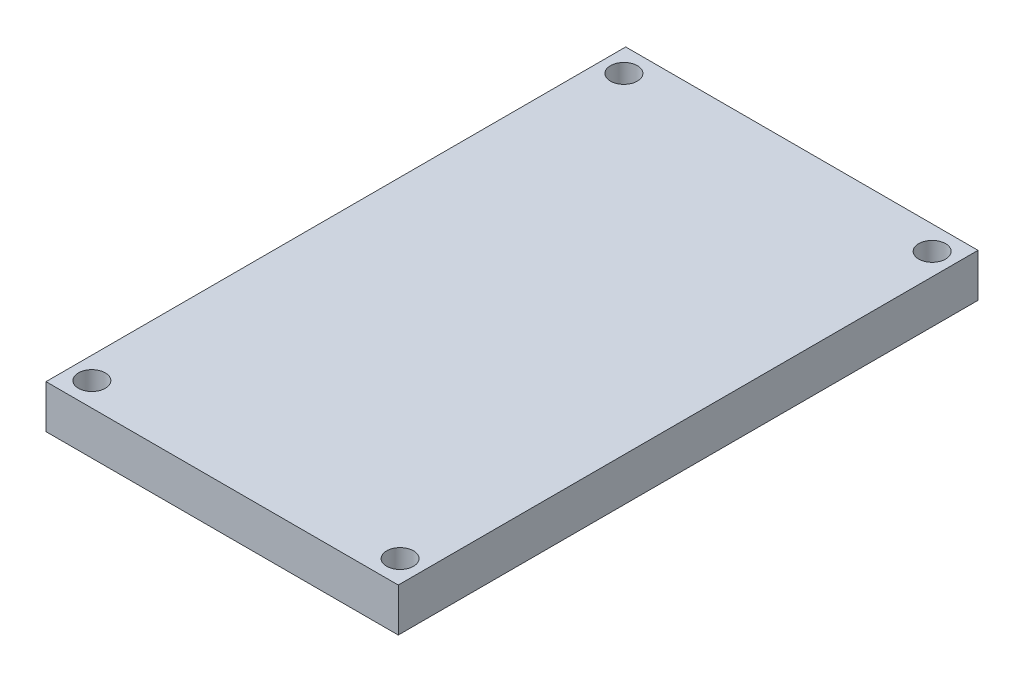
ISO-10303-21;
HEADER;
FILE_DESCRIPTION(('STEP AP214'),'2;1');
FILE_NAME('part.step','',(''),(''),'','','');
FILE_SCHEMA(('AUTOMOTIVE_DESIGN { 1 0 10303 214 1 1 1 1 }'));
ENDSEC;
DATA;
#1=APPLICATION_CONTEXT('core data for automotive mechanical design processes');
#2=APPLICATION_PROTOCOL_DEFINITION('international standard','automotive_design',2000,#1);
#3=PRODUCT_CONTEXT('',#1,'mechanical');
#4=PRODUCT('Part','Part','',(#3));
#5=PRODUCT_RELATED_PRODUCT_CATEGORY('part','',(#4));
#6=PRODUCT_DEFINITION_FORMATION('','',#4);
#7=PRODUCT_DEFINITION_CONTEXT('part definition',#1,'design');
#8=PRODUCT_DEFINITION('design','',#6,#7);
#9=PRODUCT_DEFINITION_SHAPE('','',#8);
#10=(LENGTH_UNIT() NAMED_UNIT(*) SI_UNIT(.MILLI.,.METRE.));
#11=(NAMED_UNIT(*) PLANE_ANGLE_UNIT() SI_UNIT($,.RADIAN.));
#12=(NAMED_UNIT(*) SI_UNIT($,.STERADIAN.) SOLID_ANGLE_UNIT());
#13=UNCERTAINTY_MEASURE_WITH_UNIT(LENGTH_MEASURE(1.E-05),#10,'distance_accuracy_value','');
#14=(GEOMETRIC_REPRESENTATION_CONTEXT(3) GLOBAL_UNCERTAINTY_ASSIGNED_CONTEXT((#13)) GLOBAL_UNIT_ASSIGNED_CONTEXT((#10,
#11,#12)) REPRESENTATION_CONTEXT('',''));
#15=CARTESIAN_POINT('',(0.,0.,0.));
#16=DIRECTION('',(0.,0.,1.));
#17=DIRECTION('',(1.,0.,0.));
#18=AXIS2_PLACEMENT_3D('',#15,#16,#17);
#19=CARTESIAN_POINT('',(0.,5.,0.));
#20=DIRECTION('',(0.,1.,0.));
#21=DIRECTION('',(0.,0.,1.));
#22=AXIS2_PLACEMENT_3D('',#19,#20,#21);
#23=PLANE('',#22);
#24=CARTESIAN_POINT('',(17.78,5.,30.69));
#25=DIRECTION('',(0.,1.,0.));
#26=DIRECTION('',(0.,0.,1.));
#27=AXIS2_PLACEMENT_3D('',#24,#25,#26);
#28=CIRCLE('',#27,1.55);
#29=CARTESIAN_POINT('',(17.78,5.,32.24));
#30=VERTEX_POINT('',#29);
#31=EDGE_CURVE('E129',#30,#30,#28,.T.);
#32=ORIENTED_EDGE('',*,*,#31,.F.);
#33=EDGE_LOOP('',(#32));
#34=FACE_BOUND('',#33,.T.);
#35=CARTESIAN_POINT('',(-17.78,5.,-30.69));
#36=DIRECTION('',(0.,1.,0.));
#37=DIRECTION('',(0.,0.,1.));
#38=AXIS2_PLACEMENT_3D('',#35,#36,#37);
#39=CIRCLE('',#38,1.55);
#40=CARTESIAN_POINT('',(-17.78,5.,-29.14));
#41=VERTEX_POINT('',#40);
#42=EDGE_CURVE('E108',#41,#41,#39,.T.);
#43=ORIENTED_EDGE('',*,*,#42,.F.);
#44=EDGE_LOOP('',(#43));
#45=FACE_BOUND('',#44,.T.);
#46=DIRECTION('',(0.,0.,-1.));
#47=VECTOR('',#46,1.);
#48=CARTESIAN_POINT('',(20.32,5.,-33.44));
#49=LINE('',#48,#47);
#50=CARTESIAN_POINT('',(20.32,5.,33.44));
#51=VERTEX_POINT('',#50);
#52=CARTESIAN_POINT('',(20.32,5.,-33.44));
#53=VERTEX_POINT('',#52);
#54=EDGE_CURVE('E93',#51,#53,#49,.T.);
#55=ORIENTED_EDGE('',*,*,#54,.T.);
#56=DIRECTION('',(-1.,0.,0.));
#57=VECTOR('',#56,1.);
#58=CARTESIAN_POINT('',(-20.32,5.,-33.44));
#59=LINE('',#58,#57);
#60=CARTESIAN_POINT('',(-20.32,5.,-33.44));
#61=VERTEX_POINT('',#60);
#62=EDGE_CURVE('E88',#53,#61,#59,.T.);
#63=ORIENTED_EDGE('',*,*,#62,.T.);
#64=DIRECTION('',(0.,0.,1.));
#65=VECTOR('',#64,1.);
#66=CARTESIAN_POINT('',(-20.32,5.,-33.44));
#67=LINE('',#66,#65);
#68=CARTESIAN_POINT('',(-20.32,5.,33.44));
#69=VERTEX_POINT('',#68);
#70=EDGE_CURVE('E91',#61,#69,#67,.T.);
#71=ORIENTED_EDGE('',*,*,#70,.T.);
#72=DIRECTION('',(1.,0.,0.));
#73=VECTOR('',#72,1.);
#74=CARTESIAN_POINT('',(-20.32,5.,33.44));
#75=LINE('',#74,#73);
#76=EDGE_CURVE('E58',#69,#51,#75,.T.);
#77=ORIENTED_EDGE('',*,*,#76,.T.);
#78=EDGE_LOOP('',(#55,#63,#71,#77));
#79=FACE_BOUND('',#78,.T.);
#80=CARTESIAN_POINT('',(17.78,5.,-30.69));
#81=DIRECTION('',(0.,1.,0.));
#82=DIRECTION('',(0.,0.,-1.));
#83=AXIS2_PLACEMENT_3D('',#80,#81,#82);
#84=CIRCLE('',#83,1.55);
#85=CARTESIAN_POINT('',(17.78,5.,-32.24));
#86=VERTEX_POINT('',#85);
#87=EDGE_CURVE('E123',#86,#86,#84,.T.);
#88=ORIENTED_EDGE('',*,*,#87,.F.);
#89=EDGE_LOOP('',(#88));
#90=FACE_BOUND('',#89,.T.);
#91=CARTESIAN_POINT('',(-17.78,5.,30.69));
#92=DIRECTION('',(0.,1.,0.));
#93=DIRECTION('',(0.,0.,-1.));
#94=AXIS2_PLACEMENT_3D('',#91,#92,#93);
#95=CIRCLE('',#94,1.55);
#96=CARTESIAN_POINT('',(-17.78,5.,29.14));
#97=VERTEX_POINT('',#96);
#98=EDGE_CURVE('E135',#97,#97,#95,.T.);
#99=ORIENTED_EDGE('',*,*,#98,.F.);
#100=EDGE_LOOP('',(#99));
#101=FACE_BOUND('',#100,.T.);
#102=ADVANCED_FACE('F41',(#34,#45,#79,#90,#101),#23,.T.);
#103=CARTESIAN_POINT('',(0.,0.,0.));
#104=DIRECTION('',(0.,1.,0.));
#105=DIRECTION('',(0.,0.,1.));
#106=AXIS2_PLACEMENT_3D('',#103,#104,#105);
#107=PLANE('',#106);
#108=DIRECTION('',(0.,0.,-1.));
#109=VECTOR('',#108,1.);
#110=CARTESIAN_POINT('',(20.32,0.,-33.44));
#111=LINE('',#110,#109);
#112=CARTESIAN_POINT('',(20.32,0.,33.44));
#113=VERTEX_POINT('',#112);
#114=CARTESIAN_POINT('',(20.32,0.,-33.44));
#115=VERTEX_POINT('',#114);
#116=EDGE_CURVE('E105',#113,#115,#111,.T.);
#117=ORIENTED_EDGE('',*,*,#116,.F.);
#118=DIRECTION('',(1.,0.,0.));
#119=VECTOR('',#118,1.);
#120=CARTESIAN_POINT('',(-20.32,0.,33.44));
#121=LINE('',#120,#119);
#122=CARTESIAN_POINT('',(-20.32,0.,33.44));
#123=VERTEX_POINT('',#122);
#124=EDGE_CURVE('E81',#123,#113,#121,.T.);
#125=ORIENTED_EDGE('',*,*,#124,.F.);
#126=DIRECTION('',(0.,0.,1.));
#127=VECTOR('',#126,1.);
#128=CARTESIAN_POINT('',(-20.32,0.,-33.44));
#129=LINE('',#128,#127);
#130=CARTESIAN_POINT('',(-20.32,0.,-33.44));
#131=VERTEX_POINT('',#130);
#132=EDGE_CURVE('E75',#131,#123,#129,.T.);
#133=ORIENTED_EDGE('',*,*,#132,.F.);
#134=DIRECTION('',(-1.,0.,0.));
#135=VECTOR('',#134,1.);
#136=CARTESIAN_POINT('',(-20.32,0.,-33.44));
#137=LINE('',#136,#135);
#138=EDGE_CURVE('E97',#115,#131,#137,.T.);
#139=ORIENTED_EDGE('',*,*,#138,.F.);
#140=EDGE_LOOP('',(#117,#125,#133,#139));
#141=FACE_BOUND('',#140,.T.);
#142=CARTESIAN_POINT('',(-17.78,0.,-30.69));
#143=DIRECTION('',(0.,1.,0.));
#144=DIRECTION('',(0.,0.,1.));
#145=AXIS2_PLACEMENT_3D('',#142,#143,#144);
#146=CIRCLE('',#145,1.55);
#147=CARTESIAN_POINT('',(-17.78,0.,-29.14));
#148=VERTEX_POINT('',#147);
#149=EDGE_CURVE('E120',#148,#148,#146,.T.);
#150=ORIENTED_EDGE('',*,*,#149,.T.);
#151=EDGE_LOOP('',(#150));
#152=FACE_BOUND('',#151,.T.);
#153=CARTESIAN_POINT('',(17.78,0.,-30.69));
#154=DIRECTION('',(0.,1.,0.));
#155=DIRECTION('',(0.,0.,-1.));
#156=AXIS2_PLACEMENT_3D('',#153,#154,#155);
#157=CIRCLE('',#156,1.55);
#158=CARTESIAN_POINT('',(17.78,0.,-32.24));
#159=VERTEX_POINT('',#158);
#160=EDGE_CURVE('E126',#159,#159,#157,.T.);
#161=ORIENTED_EDGE('',*,*,#160,.T.);
#162=EDGE_LOOP('',(#161));
#163=FACE_BOUND('',#162,.T.);
#164=CARTESIAN_POINT('',(17.78,0.,30.69));
#165=DIRECTION('',(0.,1.,0.));
#166=DIRECTION('',(0.,0.,1.));
#167=AXIS2_PLACEMENT_3D('',#164,#165,#166);
#168=CIRCLE('',#167,1.55);
#169=CARTESIAN_POINT('',(17.78,0.,32.24));
#170=VERTEX_POINT('',#169);
#171=EDGE_CURVE('E132',#170,#170,#168,.T.);
#172=ORIENTED_EDGE('',*,*,#171,.T.);
#173=EDGE_LOOP('',(#172));
#174=FACE_BOUND('',#173,.T.);
#175=CARTESIAN_POINT('',(-17.78,0.,30.69));
#176=DIRECTION('',(0.,1.,0.));
#177=DIRECTION('',(0.,0.,-1.));
#178=AXIS2_PLACEMENT_3D('',#175,#176,#177);
#179=CIRCLE('',#178,1.55);
#180=CARTESIAN_POINT('',(-17.78,0.,29.14));
#181=VERTEX_POINT('',#180);
#182=EDGE_CURVE('E138',#181,#181,#179,.T.);
#183=ORIENTED_EDGE('',*,*,#182,.T.);
#184=EDGE_LOOP('',(#183));
#185=FACE_BOUND('',#184,.T.);
#186=ADVANCED_FACE('F116',(#141,#152,#163,#174,#185),#107,.F.);
#187=CARTESIAN_POINT('',(20.32,5.,-33.44));
#188=DIRECTION('',(-1.,0.,0.));
#189=DIRECTION('',(0.,0.,1.));
#190=AXIS2_PLACEMENT_3D('',#187,#188,#189);
#191=PLANE('',#190);
#192=ORIENTED_EDGE('',*,*,#116,.T.);
#193=DIRECTION('',(0.,-1.,0.));
#194=VECTOR('',#193,1.);
#195=CARTESIAN_POINT('',(20.32,5.,-33.44));
#196=LINE('',#195,#194);
#197=EDGE_CURVE('E11',#53,#115,#196,.T.);
#198=ORIENTED_EDGE('',*,*,#197,.F.);
#199=ORIENTED_EDGE('',*,*,#54,.F.);
#200=DIRECTION('',(0.,-1.,0.));
#201=VECTOR('',#200,1.);
#202=CARTESIAN_POINT('',(20.32,5.,33.44));
#203=LINE('',#202,#201);
#204=EDGE_CURVE('E101',#51,#113,#203,.T.);
#205=ORIENTED_EDGE('',*,*,#204,.T.);
#206=EDGE_LOOP('',(#192,#198,#199,#205));
#207=FACE_BOUND('',#206,.T.);
#208=ADVANCED_FACE('F43',(#207),#191,.F.);
#209=CARTESIAN_POINT('',(-20.32,5.,-33.44));
#210=DIRECTION('',(0.,0.,1.));
#211=DIRECTION('',(1.,0.,0.));
#212=AXIS2_PLACEMENT_3D('',#209,#210,#211);
#213=PLANE('',#212);
#214=ORIENTED_EDGE('',*,*,#138,.T.);
#215=DIRECTION('',(0.,-1.,0.));
#216=VECTOR('',#215,1.);
#217=CARTESIAN_POINT('',(-20.32,5.,-33.44));
#218=LINE('',#217,#216);
#219=EDGE_CURVE('E50',#61,#131,#218,.T.);
#220=ORIENTED_EDGE('',*,*,#219,.F.);
#221=ORIENTED_EDGE('',*,*,#62,.F.);
#222=ORIENTED_EDGE('',*,*,#197,.T.);
#223=EDGE_LOOP('',(#214,#220,#221,#222));
#224=FACE_BOUND('',#223,.T.);
#225=ADVANCED_FACE('F96',(#224),#213,.F.);
#226=CARTESIAN_POINT('',(-20.32,5.,-33.44));
#227=DIRECTION('',(1.,0.,0.));
#228=DIRECTION('',(0.,0.,-1.));
#229=AXIS2_PLACEMENT_3D('',#226,#227,#228);
#230=PLANE('',#229);
#231=ORIENTED_EDGE('',*,*,#132,.T.);
#232=DIRECTION('',(0.,-1.,0.));
#233=VECTOR('',#232,1.);
#234=CARTESIAN_POINT('',(-20.32,5.,33.44));
#235=LINE('',#234,#233);
#236=EDGE_CURVE('E98',#69,#123,#235,.T.);
#237=ORIENTED_EDGE('',*,*,#236,.F.);
#238=ORIENTED_EDGE('',*,*,#70,.F.);
#239=ORIENTED_EDGE('',*,*,#219,.T.);
#240=EDGE_LOOP('',(#231,#237,#238,#239));
#241=FACE_BOUND('',#240,.T.);
#242=ADVANCED_FACE('F99',(#241),#230,.F.);
#243=CARTESIAN_POINT('',(-20.32,5.,33.44));
#244=DIRECTION('',(0.,0.,-1.));
#245=DIRECTION('',(-1.,0.,0.));
#246=AXIS2_PLACEMENT_3D('',#243,#244,#245);
#247=PLANE('',#246);
#248=ORIENTED_EDGE('',*,*,#124,.T.);
#249=ORIENTED_EDGE('',*,*,#204,.F.);
#250=ORIENTED_EDGE('',*,*,#76,.F.);
#251=ORIENTED_EDGE('',*,*,#236,.T.);
#252=EDGE_LOOP('',(#248,#249,#250,#251));
#253=FACE_BOUND('',#252,.T.);
#254=ADVANCED_FACE('F113',(#253),#247,.F.);
#255=CARTESIAN_POINT('',(-17.78,5.,-30.69));
#256=DIRECTION('',(0.,-1.,0.));
#257=DIRECTION('',(0.,0.,-1.));
#258=AXIS2_PLACEMENT_3D('',#255,#256,#257);
#259=CYLINDRICAL_SURFACE('',#258,1.55);
#260=ORIENTED_EDGE('',*,*,#42,.T.);
#261=EDGE_LOOP('',(#260));
#262=FACE_BOUND('',#261,.T.);
#263=ORIENTED_EDGE('',*,*,#149,.F.);
#264=EDGE_LOOP('',(#263));
#265=FACE_BOUND('',#264,.T.);
#266=ADVANCED_FACE('F157',(#262,#265),#259,.F.);
#267=CARTESIAN_POINT('',(17.78,5.,-30.69));
#268=DIRECTION('',(0.,-1.,0.));
#269=DIRECTION('',(0.,0.,-1.));
#270=AXIS2_PLACEMENT_3D('',#267,#268,#269);
#271=CYLINDRICAL_SURFACE('',#270,1.55);
#272=ORIENTED_EDGE('',*,*,#87,.T.);
#273=EDGE_LOOP('',(#272));
#274=FACE_BOUND('',#273,.T.);
#275=ORIENTED_EDGE('',*,*,#160,.F.);
#276=EDGE_LOOP('',(#275));
#277=FACE_BOUND('',#276,.T.);
#278=ADVANCED_FACE('F202',(#274,#277),#271,.F.);
#279=CARTESIAN_POINT('',(17.78,5.,30.69));
#280=DIRECTION('',(0.,-1.,0.));
#281=DIRECTION('',(0.,0.,-1.));
#282=AXIS2_PLACEMENT_3D('',#279,#280,#281);
#283=CYLINDRICAL_SURFACE('',#282,1.55);
#284=ORIENTED_EDGE('',*,*,#31,.T.);
#285=EDGE_LOOP('',(#284));
#286=FACE_BOUND('',#285,.T.);
#287=ORIENTED_EDGE('',*,*,#171,.F.);
#288=EDGE_LOOP('',(#287));
#289=FACE_BOUND('',#288,.T.);
#290=ADVANCED_FACE('F210',(#286,#289),#283,.F.);
#291=CARTESIAN_POINT('',(-17.78,5.,30.69));
#292=DIRECTION('',(0.,-1.,0.));
#293=DIRECTION('',(0.,0.,-1.));
#294=AXIS2_PLACEMENT_3D('',#291,#292,#293);
#295=CYLINDRICAL_SURFACE('',#294,1.55);
#296=ORIENTED_EDGE('',*,*,#98,.T.);
#297=EDGE_LOOP('',(#296));
#298=FACE_BOUND('',#297,.T.);
#299=ORIENTED_EDGE('',*,*,#182,.F.);
#300=EDGE_LOOP('',(#299));
#301=FACE_BOUND('',#300,.T.);
#302=ADVANCED_FACE('F144',(#298,#301),#295,.F.);
#303=CLOSED_SHELL('',(#102,#186,#208,#225,#242,#254,#266,#278,#290,#302));
#304=MANIFOLD_SOLID_BREP('B2',#303);
#305=ADVANCED_BREP_SHAPE_REPRESENTATION('',(#18,#304),#14);
#306=SHAPE_DEFINITION_REPRESENTATION(#9,#305);
ENDSEC;
END-ISO-10303-21;
